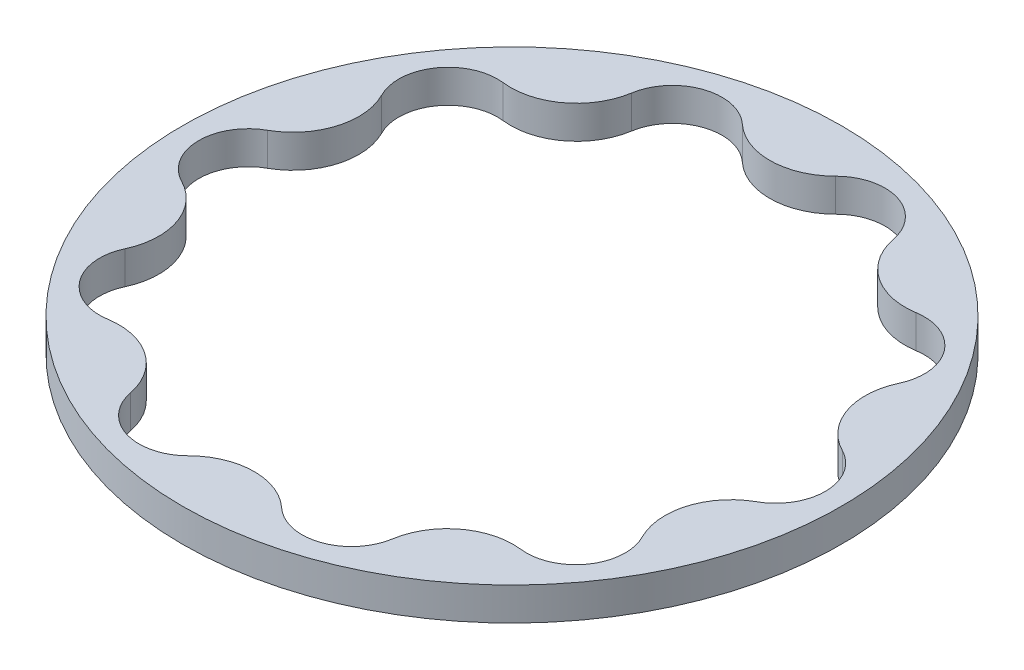
ISO-10303-21;
HEADER;
FILE_DESCRIPTION(('STEP AP214'),'2;1');
FILE_NAME('part.step','',(''),(''),'','','');
FILE_SCHEMA(('AUTOMOTIVE_DESIGN { 1 0 10303 214 1 1 1 1 }'));
ENDSEC;
DATA;
#1=APPLICATION_CONTEXT('core data for automotive mechanical design processes');
#2=APPLICATION_PROTOCOL_DEFINITION('international standard','automotive_design',2000,#1);
#3=PRODUCT_CONTEXT('',#1,'mechanical');
#4=PRODUCT('Part','Part','',(#3));
#5=PRODUCT_RELATED_PRODUCT_CATEGORY('part','',(#4));
#6=PRODUCT_DEFINITION_FORMATION('','',#4);
#7=PRODUCT_DEFINITION_CONTEXT('part definition',#1,'design');
#8=PRODUCT_DEFINITION('design','',#6,#7);
#9=PRODUCT_DEFINITION_SHAPE('','',#8);
#10=(LENGTH_UNIT() NAMED_UNIT(*) SI_UNIT(.MILLI.,.METRE.));
#11=(NAMED_UNIT(*) PLANE_ANGLE_UNIT() SI_UNIT($,.RADIAN.));
#12=(NAMED_UNIT(*) SI_UNIT($,.STERADIAN.) SOLID_ANGLE_UNIT());
#13=UNCERTAINTY_MEASURE_WITH_UNIT(LENGTH_MEASURE(1.E-05),#10,'distance_accuracy_value','');
#14=(GEOMETRIC_REPRESENTATION_CONTEXT(3) GLOBAL_UNCERTAINTY_ASSIGNED_CONTEXT((#13)) GLOBAL_UNIT_ASSIGNED_CONTEXT((#10,
#11,#12)) REPRESENTATION_CONTEXT('',''));
#15=CARTESIAN_POINT('',(0.,0.,0.));
#16=DIRECTION('',(0.,0.,1.));
#17=DIRECTION('',(1.,0.,0.));
#18=AXIS2_PLACEMENT_3D('',#15,#16,#17);
#19=CARTESIAN_POINT('',(-25.6423198178453,10.,-74.3524978353741));
#20=DIRECTION('',(0.,-1.,0.));
#21=DIRECTION('',(0.,0.,-1.));
#22=AXIS2_PLACEMENT_3D('',#19,#20,#21);
#23=CYLINDRICAL_SURFACE('',#22,15.);
#24=CARTESIAN_POINT('',(-25.6423198178453,0.,-74.3524978353741));
#25=DIRECTION('',(0.,1.,0.));
#26=DIRECTION('',(0.,0.,1.));
#27=AXIS2_PLACEMENT_3D('',#24,#25,#26);
#28=CIRCLE('',#27,15.);
#29=CARTESIAN_POINT('',(-40.455763135708,0.,-76.7108652936951));
#30=VERTEX_POINT('',#29);
#31=CARTESIAN_POINT('',(-15.4318718264707,0.,-85.3409805247828));
#32=VERTEX_POINT('',#31);
#33=EDGE_CURVE('E223',#30,#32,#28,.F.);
#34=ORIENTED_EDGE('',*,*,#33,.T.);
#35=DIRECTION('',(0.,-1.,0.));
#36=VECTOR('',#35,1.);
#37=CARTESIAN_POINT('',(-15.4318718264707,10.,-85.3409805247828));
#38=LINE('',#37,#36);
#39=CARTESIAN_POINT('',(-15.4318718264707,10.,-85.3409805247828));
#40=VERTEX_POINT('',#39);
#41=EDGE_CURVE('E11',#40,#32,#38,.T.);
#42=ORIENTED_EDGE('',*,*,#41,.F.);
#43=CARTESIAN_POINT('',(-25.6423198178453,10.,-74.3524978353741));
#44=DIRECTION('',(0.,1.,0.));
#45=DIRECTION('',(0.,0.,1.));
#46=AXIS2_PLACEMENT_3D('',#43,#44,#45);
#47=CIRCLE('',#46,15.);
#48=CARTESIAN_POINT('',(-40.455763135708,10.,-76.7108652936951));
#49=VERTEX_POINT('',#48);
#50=EDGE_CURVE('E420',#49,#40,#47,.F.);
#51=ORIENTED_EDGE('',*,*,#50,.F.);
#52=DIRECTION('',(0.,-1.,0.));
#53=VECTOR('',#52,1.);
#54=CARTESIAN_POINT('',(-40.455763135708,10.,-76.7108652936951));
#55=LINE('',#54,#53);
#56=EDGE_CURVE('E215',#49,#30,#55,.T.);
#57=ORIENTED_EDGE('',*,*,#56,.T.);
#58=EDGE_LOOP('',(#34,#42,#51,#57));
#59=FACE_BOUND('',#58,.T.);
#60=ADVANCED_FACE('F45',(#59),#23,.F.);
#61=CARTESIAN_POINT('',(-1.79476209093551,10.,-100.017236100354));
#62=DIRECTION('',(0.,-1.,0.));
#63=DIRECTION('',(0.,0.,-1.));
#64=AXIS2_PLACEMENT_3D('',#61,#62,#63);
#65=CYLINDRICAL_SURFACE('',#64,20.0340520029903);
#66=CARTESIAN_POINT('',(-1.79476209093551,0.,-100.017236100354));
#67=DIRECTION('',(0.,1.,0.));
#68=DIRECTION('',(0.,0.,1.));
#69=AXIS2_PLACEMENT_3D('',#66,#67,#68);
#70=CIRCLE('',#69,20.0340520029903);
#71=CARTESIAN_POINT('',(12.3601154130329,0.,-85.8396946172137));
#72=VERTEX_POINT('',#71);
#73=EDGE_CURVE('E227',#32,#72,#70,.T.);
#74=ORIENTED_EDGE('',*,*,#73,.T.);
#75=DIRECTION('',(0.,-1.,0.));
#76=VECTOR('',#75,1.);
#77=CARTESIAN_POINT('',(12.3601154130329,10.,-85.8396946172137));
#78=LINE('',#77,#76);
#79=CARTESIAN_POINT('',(12.3601154130329,10.,-85.8396946172137));
#80=VERTEX_POINT('',#79);
#81=EDGE_CURVE('E55',#80,#72,#78,.T.);
#82=ORIENTED_EDGE('',*,*,#81,.F.);
#83=CARTESIAN_POINT('',(-1.79476209093551,10.,-100.017236100354));
#84=DIRECTION('',(0.,1.,0.));
#85=DIRECTION('',(0.,0.,1.));
#86=AXIS2_PLACEMENT_3D('',#83,#84,#85);
#87=CIRCLE('',#86,20.0340520029903);
#88=EDGE_CURVE('E142',#40,#80,#87,.T.);
#89=ORIENTED_EDGE('',*,*,#88,.F.);
#90=ORIENTED_EDGE('',*,*,#41,.T.);
#91=EDGE_LOOP('',(#74,#82,#89,#90));
#92=FACE_BOUND('',#91,.T.);
#93=ADVANCED_FACE('F434',(#92),#65,.T.);
#94=CARTESIAN_POINT('',(22.9582291909062,10.,-75.2246117465409));
#95=DIRECTION('',(0.,-1.,0.));
#96=DIRECTION('',(0.,0.,-1.));
#97=AXIS2_PLACEMENT_3D('',#94,#95,#96);
#98=CYLINDRICAL_SURFACE('',#97,15.);
#99=CARTESIAN_POINT('',(22.9582291909062,0.,-75.2246117465409));
#100=DIRECTION('',(0.,1.,0.));
#101=DIRECTION('',(0.,0.,1.));
#102=AXIS2_PLACEMENT_3D('',#99,#100,#101);
#103=CIRCLE('',#102,15.);
#104=CARTESIAN_POINT('',(37.6775232060154,0.,-78.1129302360382));
#105=VERTEX_POINT('',#104);
#106=EDGE_CURVE('E230',#72,#105,#103,.F.);
#107=ORIENTED_EDGE('',*,*,#106,.T.);
#108=DIRECTION('',(0.,-1.,0.));
#109=VECTOR('',#108,1.);
#110=CARTESIAN_POINT('',(37.6775232060154,10.,-78.1129302360382));
#111=LINE('',#110,#109);
#112=CARTESIAN_POINT('',(37.6775232060154,10.,-78.1129302360382));
#113=VERTEX_POINT('',#112);
#114=EDGE_CURVE('E340',#113,#105,#111,.T.);
#115=ORIENTED_EDGE('',*,*,#114,.F.);
#116=CARTESIAN_POINT('',(22.9582291909062,10.,-75.2246117465409));
#117=DIRECTION('',(0.,1.,0.));
#118=DIRECTION('',(0.,0.,1.));
#119=AXIS2_PLACEMENT_3D('',#116,#117,#118);
#120=CIRCLE('',#119,15.);
#121=EDGE_CURVE('E350',#80,#113,#120,.F.);
#122=ORIENTED_EDGE('',*,*,#121,.F.);
#123=ORIENTED_EDGE('',*,*,#81,.T.);
#124=EDGE_LOOP('',(#107,#115,#122,#123));
#125=FACE_BOUND('',#124,.T.);
#126=ADVANCED_FACE('F348',(#125),#98,.F.);
#127=CARTESIAN_POINT('',(57.3366633224155,10.,-81.9705784240239));
#128=DIRECTION('',(0.,-1.,0.));
#129=DIRECTION('',(0.,0.,-1.));
#130=AXIS2_PLACEMENT_3D('',#127,#128,#129);
#131=CYLINDRICAL_SURFACE('',#130,20.0340520029903);
#132=CARTESIAN_POINT('',(57.3366633224155,0.,-81.9705784240239));
#133=DIRECTION('',(0.,1.,0.));
#134=DIRECTION('',(0.,0.,1.));
#135=AXIS2_PLACEMENT_3D('',#132,#133,#134);
#136=CIRCLE('',#135,20.0340520029903);
#137=CARTESIAN_POINT('',(60.4548499788668,0.,-62.1806781808683));
#138=VERTEX_POINT('',#137);
#139=EDGE_CURVE('E233',#105,#138,#136,.T.);
#140=ORIENTED_EDGE('',*,*,#139,.T.);
#141=DIRECTION('',(0.,-1.,0.));
#142=VECTOR('',#141,1.);
#143=CARTESIAN_POINT('',(60.4548499788668,10.,-62.1806781808683));
#144=LINE('',#143,#142);
#145=CARTESIAN_POINT('',(60.4548499788668,10.,-62.1806781808683));
#146=VERTEX_POINT('',#145);
#147=EDGE_CURVE('E336',#146,#138,#144,.T.);
#148=ORIENTED_EDGE('',*,*,#147,.F.);
#149=CARTESIAN_POINT('',(57.3366633224155,10.,-81.9705784240239));
#150=DIRECTION('',(0.,1.,0.));
#151=DIRECTION('',(0.,0.,1.));
#152=AXIS2_PLACEMENT_3D('',#149,#150,#151);
#153=CIRCLE('',#152,20.0340520029903);
#154=EDGE_CURVE('E369',#113,#146,#153,.T.);
#155=ORIENTED_EDGE('',*,*,#154,.F.);
#156=ORIENTED_EDGE('',*,*,#114,.T.);
#157=EDGE_LOOP('',(#140,#148,#155,#156));
#158=FACE_BOUND('',#157,.T.);
#159=ADVANCED_FACE('F359',(#158),#131,.T.);
#160=CARTESIAN_POINT('',(62.7895149702417,10.,-47.363480761044));
#161=DIRECTION('',(0.,-1.,0.));
#162=DIRECTION('',(0.,0.,-1.));
#163=AXIS2_PLACEMENT_3D('',#160,#161,#162);
#164=CYLINDRICAL_SURFACE('',#163,15.);
#165=CARTESIAN_POINT('',(62.7895149702417,0.,-47.363480761044));
#166=DIRECTION('',(0.,1.,0.));
#167=DIRECTION('',(0.,0.,1.));
#168=AXIS2_PLACEMENT_3D('',#165,#166,#167);
#169=CIRCLE('',#168,15.);
#170=CARTESIAN_POINT('',(76.3953849857166,0.,-41.0483955579766));
#171=VERTEX_POINT('',#170);
#172=EDGE_CURVE('E236',#138,#171,#169,.F.);
#173=ORIENTED_EDGE('',*,*,#172,.T.);
#174=DIRECTION('',(0.,-1.,0.));
#175=VECTOR('',#174,1.);
#176=CARTESIAN_POINT('',(76.3953849857166,10.,-41.0483955579766));
#177=LINE('',#176,#175);
#178=CARTESIAN_POINT('',(76.3953849857166,10.,-41.0483955579766));
#179=VERTEX_POINT('',#178);
#180=EDGE_CURVE('E332',#179,#171,#177,.T.);
#181=ORIENTED_EDGE('',*,*,#180,.F.);
#182=CARTESIAN_POINT('',(62.7895149702417,10.,-47.363480761044));
#183=DIRECTION('',(0.,1.,0.));
#184=DIRECTION('',(0.,0.,1.));
#185=AXIS2_PLACEMENT_3D('',#182,#183,#184);
#186=CIRCLE('',#185,15.);
#187=EDGE_CURVE('E365',#146,#179,#186,.F.);
#188=ORIENTED_EDGE('',*,*,#187,.F.);
#189=ORIENTED_EDGE('',*,*,#147,.T.);
#190=EDGE_LOOP('',(#173,#181,#188,#189));
#191=FACE_BOUND('',#190,.T.);
#192=ADVANCED_FACE('F363',(#191),#164,.F.);
#193=CARTESIAN_POINT('',(94.5674321481134,10.,-32.6139458672055));
#194=DIRECTION('',(0.,-1.,0.));
#195=DIRECTION('',(0.,0.,-1.));
#196=AXIS2_PLACEMENT_3D('',#193,#194,#195);
#197=CYLINDRICAL_SURFACE('',#196,20.0340520029903);
#198=CARTESIAN_POINT('',(94.5674321481134,0.,-32.6139458672055));
#199=DIRECTION('',(0.,1.,0.));
#200=DIRECTION('',(0.,0.,1.));
#201=AXIS2_PLACEMENT_3D('',#198,#199,#200);
#202=CIRCLE('',#201,20.0340520029903);
#203=CARTESIAN_POINT('',(85.4578866375495,0.,-14.7707561229505));
#204=VERTEX_POINT('',#203);
#205=EDGE_CURVE('E239',#171,#204,#202,.T.);
#206=ORIENTED_EDGE('',*,*,#205,.T.);
#207=DIRECTION('',(0.,-1.,0.));
#208=VECTOR('',#207,1.);
#209=CARTESIAN_POINT('',(85.4578866375495,10.,-14.7707561229505));
#210=LINE('',#209,#208);
#211=CARTESIAN_POINT('',(85.4578866375495,10.,-14.7707561229505));
#212=VERTEX_POINT('',#211);
#213=EDGE_CURVE('E328',#212,#204,#210,.T.);
#214=ORIENTED_EDGE('',*,*,#213,.F.);
#215=CARTESIAN_POINT('',(94.5674321481134,10.,-32.6139458672055));
#216=DIRECTION('',(0.,1.,0.));
#217=DIRECTION('',(0.,0.,1.));
#218=AXIS2_PLACEMENT_3D('',#215,#216,#217);
#219=CIRCLE('',#218,20.0340520029903);
#220=EDGE_CURVE('E368',#179,#212,#219,.T.);
#221=ORIENTED_EDGE('',*,*,#220,.F.);
#222=ORIENTED_EDGE('',*,*,#180,.T.);
#223=EDGE_LOOP('',(#206,#214,#221,#222));
#224=FACE_BOUND('',#223,.T.);
#225=ADVANCED_FACE('F446',(#224),#197,.T.);
#226=CARTESIAN_POINT('',(78.6373401680653,10.,-1.41110995033027));
#227=DIRECTION('',(0.,-1.,0.));
#228=DIRECTION('',(0.,0.,-1.));
#229=AXIS2_PLACEMENT_3D('',#226,#227,#228);
#230=CYLINDRICAL_SURFACE('',#229,15.);
#231=CARTESIAN_POINT('',(78.6373401680653,0.,-1.41110995033027));
#232=DIRECTION('',(0.,1.,0.));
#233=DIRECTION('',(0.,0.,1.));
#234=AXIS2_PLACEMENT_3D('',#231,#232,#233);
#235=CIRCLE('',#234,15.);
#236=CARTESIAN_POINT('',(85.9328062845076,0.,11.6952310395815));
#237=VERTEX_POINT('',#236);
#238=EDGE_CURVE('E242',#204,#237,#235,.F.);
#239=ORIENTED_EDGE('',*,*,#238,.T.);
#240=DIRECTION('',(0.,-1.,0.));
#241=VECTOR('',#240,1.);
#242=CARTESIAN_POINT('',(85.9328062845076,10.,11.6952310395815));
#243=LINE('',#242,#241);
#244=CARTESIAN_POINT('',(85.9328062845076,10.,11.6952310395815));
#245=VERTEX_POINT('',#244);
#246=EDGE_CURVE('E324',#245,#237,#243,.T.);
#247=ORIENTED_EDGE('',*,*,#246,.F.);
#248=CARTESIAN_POINT('',(78.6373401680653,10.,-1.41110995033027));
#249=DIRECTION('',(0.,1.,0.));
#250=DIRECTION('',(0.,0.,1.));
#251=AXIS2_PLACEMENT_3D('',#248,#249,#250);
#252=CIRCLE('',#251,15.);
#253=EDGE_CURVE('E373',#212,#245,#252,.F.);
#254=ORIENTED_EDGE('',*,*,#253,.F.);
#255=ORIENTED_EDGE('',*,*,#213,.T.);
#256=EDGE_LOOP('',(#239,#247,#254,#255));
#257=FACE_BOUND('',#256,.T.);
#258=ADVANCED_FACE('F449',(#257),#230,.F.);
#259=CARTESIAN_POINT('',(95.6766561220316,10.,29.200105503636));
#260=DIRECTION('',(0.,-1.,0.));
#261=DIRECTION('',(0.,0.,-1.));
#262=AXIS2_PLACEMENT_3D('',#259,#260,#261);
#263=CYLINDRICAL_SURFACE('',#262,20.0340520029904);
#264=CARTESIAN_POINT('',(95.6766561220316,0.,29.200105503636));
#265=DIRECTION('',(0.,1.,0.));
#266=DIRECTION('',(0.,0.,1.));
#267=AXIS2_PLACEMENT_3D('',#264,#265,#266);
#268=CIRCLE('',#267,20.0340520029904);
#269=CARTESIAN_POINT('',(77.818915207424,0.,38.2810927343985));
#270=VERTEX_POINT('',#269);
#271=EDGE_CURVE('E245',#237,#270,#268,.T.);
#272=ORIENTED_EDGE('',*,*,#271,.T.);
#273=DIRECTION('',(0.,-1.,0.));
#274=VECTOR('',#273,1.);
#275=CARTESIAN_POINT('',(77.818915207424,10.,38.2810927343985));
#276=LINE('',#275,#274);
#277=CARTESIAN_POINT('',(77.818915207424,10.,38.2810927343985));
#278=VERTEX_POINT('',#277);
#279=EDGE_CURVE('E320',#278,#270,#276,.T.);
#280=ORIENTED_EDGE('',*,*,#279,.F.);
#281=CARTESIAN_POINT('',(95.6766561220316,10.,29.200105503636));
#282=DIRECTION('',(0.,1.,0.));
#283=DIRECTION('',(0.,0.,1.));
#284=AXIS2_PLACEMENT_3D('',#281,#282,#283);
#285=CIRCLE('',#284,20.0340520029904);
#286=EDGE_CURVE('E380',#245,#278,#285,.T.);
#287=ORIENTED_EDGE('',*,*,#286,.F.);
#288=ORIENTED_EDGE('',*,*,#246,.T.);
#289=EDGE_LOOP('',(#272,#280,#287,#288));
#290=FACE_BOUND('',#289,.T.);
#291=ADVANCED_FACE('F453',(#290),#263,.T.);
#292=CARTESIAN_POINT('',(64.4483742065755,10.,45.0802568995462));
#293=DIRECTION('',(0.,-1.,0.));
#294=DIRECTION('',(0.,0.,-1.));
#295=AXIS2_PLACEMENT_3D('',#292,#293,#294);
#296=CYLINDRICAL_SURFACE('',#295,15.);
#297=CARTESIAN_POINT('',(64.4483742065755,0.,45.0802568995462));
#298=DIRECTION('',(0.,1.,0.));
#299=DIRECTION('',(0.,0.,1.));
#300=AXIS2_PLACEMENT_3D('',#297,#298,#299);
#301=CIRCLE('',#300,15.);
#302=CARTESIAN_POINT('',(62.6468163312774,0.,59.971676886302));
#303=VERTEX_POINT('',#302);
#304=EDGE_CURVE('E248',#270,#303,#301,.F.);
#305=ORIENTED_EDGE('',*,*,#304,.T.);
#306=DIRECTION('',(0.,-1.,0.));
#307=VECTOR('',#306,1.);
#308=CARTESIAN_POINT('',(62.6468163312774,10.,59.971676886302));
#309=LINE('',#308,#307);
#310=CARTESIAN_POINT('',(62.6468163312774,10.,59.971676886302));
#311=VERTEX_POINT('',#310);
#312=EDGE_CURVE('E316',#311,#303,#309,.T.);
#313=ORIENTED_EDGE('',*,*,#312,.F.);
#314=CARTESIAN_POINT('',(64.4483742065755,10.,45.0802568995462));
#315=DIRECTION('',(0.,1.,0.));
#316=DIRECTION('',(0.,0.,1.));
#317=AXIS2_PLACEMENT_3D('',#314,#315,#316);
#318=CIRCLE('',#317,15.);
#319=EDGE_CURVE('E383',#278,#311,#318,.F.);
#320=ORIENTED_EDGE('',*,*,#319,.F.);
#321=ORIENTED_EDGE('',*,*,#279,.T.);
#322=EDGE_LOOP('',(#305,#313,#320,#321));
#323=FACE_BOUND('',#322,.T.);
#324=ADVANCED_FACE('F457',(#323),#296,.F.);
#325=CARTESIAN_POINT('',(60.2406493872696,10.,79.8607090471711));
#326=DIRECTION('',(0.,-1.,0.));
#327=DIRECTION('',(0.,0.,-1.));
#328=AXIS2_PLACEMENT_3D('',#325,#326,#327);
#329=CYLINDRICAL_SURFACE('',#328,20.0340520029904);
#330=CARTESIAN_POINT('',(60.2406493872696,0.,79.8607090471711));
#331=DIRECTION('',(0.,1.,0.));
#332=DIRECTION('',(0.,0.,1.));
#333=AXIS2_PLACEMENT_3D('',#330,#331,#332);
#334=CIRCLE('',#333,20.0340520029904);
#335=CARTESIAN_POINT('',(40.4557631357087,0.,76.7108652936937));
#336=VERTEX_POINT('',#335);
#337=EDGE_CURVE('E251',#303,#336,#334,.T.);
#338=ORIENTED_EDGE('',*,*,#337,.T.);
#339=DIRECTION('',(0.,-1.,0.));
#340=VECTOR('',#339,1.);
#341=CARTESIAN_POINT('',(40.4557631357087,10.,76.7108652936937));
#342=LINE('',#341,#340);
#343=CARTESIAN_POINT('',(40.4557631357087,10.,76.7108652936937));
#344=VERTEX_POINT('',#343);
#345=EDGE_CURVE('E312',#344,#336,#342,.T.);
#346=ORIENTED_EDGE('',*,*,#345,.F.);
#347=CARTESIAN_POINT('',(60.2406493872696,10.,79.8607090471711));
#348=DIRECTION('',(0.,1.,0.));
#349=DIRECTION('',(0.,0.,1.));
#350=AXIS2_PLACEMENT_3D('',#347,#348,#349);
#351=CIRCLE('',#350,20.0340520029904);
#352=EDGE_CURVE('E386',#311,#344,#351,.T.);
#353=ORIENTED_EDGE('',*,*,#352,.F.);
#354=ORIENTED_EDGE('',*,*,#312,.T.);
#355=EDGE_LOOP('',(#338,#346,#353,#354));
#356=FACE_BOUND('',#355,.T.);
#357=ADVANCED_FACE('F461',(#356),#329,.T.);
#358=CARTESIAN_POINT('',(25.642319817846,10.,74.3524978353726));
#359=DIRECTION('',(0.,-1.,0.));
#360=DIRECTION('',(0.,0.,-1.));
#361=AXIS2_PLACEMENT_3D('',#358,#359,#360);
#362=CYLINDRICAL_SURFACE('',#361,15.);
#363=CARTESIAN_POINT('',(25.642319817846,0.,74.3524978353726));
#364=DIRECTION('',(0.,1.,0.));
#365=DIRECTION('',(0.,0.,1.));
#366=AXIS2_PLACEMENT_3D('',#363,#364,#365);
#367=CIRCLE('',#366,15.);
#368=CARTESIAN_POINT('',(15.4318718264714,0.,85.3409805247814));
#369=VERTEX_POINT('',#368);
#370=EDGE_CURVE('E254',#336,#369,#367,.F.);
#371=ORIENTED_EDGE('',*,*,#370,.T.);
#372=DIRECTION('',(0.,-1.,0.));
#373=VECTOR('',#372,1.);
#374=CARTESIAN_POINT('',(15.4318718264714,10.,85.3409805247814));
#375=LINE('',#374,#373);
#376=CARTESIAN_POINT('',(15.4318718264714,10.,85.3409805247814));
#377=VERTEX_POINT('',#376);
#378=EDGE_CURVE('E308',#377,#369,#375,.T.);
#379=ORIENTED_EDGE('',*,*,#378,.F.);
#380=CARTESIAN_POINT('',(25.642319817846,10.,74.3524978353726));
#381=DIRECTION('',(0.,1.,0.));
#382=DIRECTION('',(0.,0.,1.));
#383=AXIS2_PLACEMENT_3D('',#380,#381,#382);
#384=CIRCLE('',#383,15.);
#385=EDGE_CURVE('E389',#344,#377,#384,.F.);
#386=ORIENTED_EDGE('',*,*,#385,.F.);
#387=ORIENTED_EDGE('',*,*,#345,.T.);
#388=EDGE_LOOP('',(#371,#379,#386,#387));
#389=FACE_BOUND('',#388,.T.);
#390=ADVANCED_FACE('F465',(#389),#362,.F.);
#391=CARTESIAN_POINT('',(1.79476209093625,10.,100.017236100353));
#392=DIRECTION('',(0.,-1.,0.));
#393=DIRECTION('',(0.,0.,-1.));
#394=AXIS2_PLACEMENT_3D('',#391,#392,#393);
#395=CYLINDRICAL_SURFACE('',#394,20.0340520029904);
#396=CARTESIAN_POINT('',(1.79476209093625,0.,100.017236100353));
#397=DIRECTION('',(0.,1.,0.));
#398=DIRECTION('',(0.,0.,1.));
#399=AXIS2_PLACEMENT_3D('',#396,#397,#398);
#400=CIRCLE('',#399,20.0340520029904);
#401=CARTESIAN_POINT('',(-12.3601154130321,0.,85.8396946172123));
#402=VERTEX_POINT('',#401);
#403=EDGE_CURVE('E257',#369,#402,#400,.T.);
#404=ORIENTED_EDGE('',*,*,#403,.T.);
#405=DIRECTION('',(0.,-1.,0.));
#406=VECTOR('',#405,1.);
#407=CARTESIAN_POINT('',(-12.3601154130321,10.,85.8396946172123));
#408=LINE('',#407,#406);
#409=CARTESIAN_POINT('',(-12.3601154130321,10.,85.8396946172123));
#410=VERTEX_POINT('',#409);
#411=EDGE_CURVE('E304',#410,#402,#408,.T.);
#412=ORIENTED_EDGE('',*,*,#411,.F.);
#413=CARTESIAN_POINT('',(1.79476209093625,10.,100.017236100353));
#414=DIRECTION('',(0.,1.,0.));
#415=DIRECTION('',(0.,0.,1.));
#416=AXIS2_PLACEMENT_3D('',#413,#414,#415);
#417=CIRCLE('',#416,20.0340520029904);
#418=EDGE_CURVE('E392',#377,#410,#417,.T.);
#419=ORIENTED_EDGE('',*,*,#418,.F.);
#420=ORIENTED_EDGE('',*,*,#378,.T.);
#421=EDGE_LOOP('',(#404,#412,#419,#420));
#422=FACE_BOUND('',#421,.T.);
#423=ADVANCED_FACE('F469',(#422),#395,.T.);
#424=CARTESIAN_POINT('',(-22.9582291909055,10.,75.2246117465395));
#425=DIRECTION('',(0.,-1.,0.));
#426=DIRECTION('',(0.,0.,-1.));
#427=AXIS2_PLACEMENT_3D('',#424,#425,#426);
#428=CYLINDRICAL_SURFACE('',#427,15.);
#429=CARTESIAN_POINT('',(-22.9582291909055,0.,75.2246117465395));
#430=DIRECTION('',(0.,1.,0.));
#431=DIRECTION('',(0.,0.,1.));
#432=AXIS2_PLACEMENT_3D('',#429,#430,#431);
#433=CIRCLE('',#432,15.);
#434=CARTESIAN_POINT('',(-37.6775232060147,0.,78.1129302360368));
#435=VERTEX_POINT('',#434);
#436=EDGE_CURVE('E260',#402,#435,#433,.F.);
#437=ORIENTED_EDGE('',*,*,#436,.T.);
#438=DIRECTION('',(0.,-1.,0.));
#439=VECTOR('',#438,1.);
#440=CARTESIAN_POINT('',(-37.6775232060147,10.,78.1129302360368));
#441=LINE('',#440,#439);
#442=CARTESIAN_POINT('',(-37.6775232060147,10.,78.1129302360368));
#443=VERTEX_POINT('',#442);
#444=EDGE_CURVE('E300',#443,#435,#441,.T.);
#445=ORIENTED_EDGE('',*,*,#444,.F.);
#446=CARTESIAN_POINT('',(-22.9582291909055,10.,75.2246117465395));
#447=DIRECTION('',(0.,1.,0.));
#448=DIRECTION('',(0.,0.,1.));
#449=AXIS2_PLACEMENT_3D('',#446,#447,#448);
#450=CIRCLE('',#449,15.);
#451=EDGE_CURVE('E395',#410,#443,#450,.F.);
#452=ORIENTED_EDGE('',*,*,#451,.F.);
#453=ORIENTED_EDGE('',*,*,#411,.T.);
#454=EDGE_LOOP('',(#437,#445,#452,#453));
#455=FACE_BOUND('',#454,.T.);
#456=ADVANCED_FACE('F473',(#455),#428,.F.);
#457=CARTESIAN_POINT('',(-57.3366633224148,10.,81.9705784240225));
#458=DIRECTION('',(0.,-1.,0.));
#459=DIRECTION('',(0.,0.,-1.));
#460=AXIS2_PLACEMENT_3D('',#457,#458,#459);
#461=CYLINDRICAL_SURFACE('',#460,20.0340520029904);
#462=CARTESIAN_POINT('',(-57.3366633224148,0.,81.9705784240225));
#463=DIRECTION('',(0.,1.,0.));
#464=DIRECTION('',(0.,0.,1.));
#465=AXIS2_PLACEMENT_3D('',#462,#463,#464);
#466=CIRCLE('',#465,20.0340520029904);
#467=CARTESIAN_POINT('',(-60.4548499788661,0.,62.1806781808669));
#468=VERTEX_POINT('',#467);
#469=EDGE_CURVE('E263',#435,#468,#466,.T.);
#470=ORIENTED_EDGE('',*,*,#469,.T.);
#471=DIRECTION('',(0.,-1.,0.));
#472=VECTOR('',#471,1.);
#473=CARTESIAN_POINT('',(-60.4548499788661,10.,62.1806781808669));
#474=LINE('',#473,#472);
#475=CARTESIAN_POINT('',(-60.4548499788661,10.,62.1806781808669));
#476=VERTEX_POINT('',#475);
#477=EDGE_CURVE('E296',#476,#468,#474,.T.);
#478=ORIENTED_EDGE('',*,*,#477,.F.);
#479=CARTESIAN_POINT('',(-57.3366633224148,10.,81.9705784240225));
#480=DIRECTION('',(0.,1.,0.));
#481=DIRECTION('',(0.,0.,1.));
#482=AXIS2_PLACEMENT_3D('',#479,#480,#481);
#483=CIRCLE('',#482,20.0340520029904);
#484=EDGE_CURVE('E398',#443,#476,#483,.T.);
#485=ORIENTED_EDGE('',*,*,#484,.F.);
#486=ORIENTED_EDGE('',*,*,#444,.T.);
#487=EDGE_LOOP('',(#470,#478,#485,#486));
#488=FACE_BOUND('',#487,.T.);
#489=ADVANCED_FACE('F477',(#488),#461,.T.);
#490=CARTESIAN_POINT('',(-62.789514970241,10.,47.3634807610426));
#491=DIRECTION('',(0.,-1.,0.));
#492=DIRECTION('',(0.,0.,-1.));
#493=AXIS2_PLACEMENT_3D('',#490,#491,#492);
#494=CYLINDRICAL_SURFACE('',#493,15.);
#495=CARTESIAN_POINT('',(-62.789514970241,0.,47.3634807610426));
#496=DIRECTION('',(0.,1.,0.));
#497=DIRECTION('',(0.,0.,1.));
#498=AXIS2_PLACEMENT_3D('',#495,#496,#497);
#499=CIRCLE('',#498,15.);
#500=CARTESIAN_POINT('',(-76.3953849857159,0.,41.0483955579752));
#501=VERTEX_POINT('',#500);
#502=EDGE_CURVE('E266',#468,#501,#499,.F.);
#503=ORIENTED_EDGE('',*,*,#502,.T.);
#504=DIRECTION('',(0.,-1.,0.));
#505=VECTOR('',#504,1.);
#506=CARTESIAN_POINT('',(-76.3953849857159,10.,41.0483955579752));
#507=LINE('',#506,#505);
#508=CARTESIAN_POINT('',(-76.3953849857159,10.,41.0483955579752));
#509=VERTEX_POINT('',#508);
#510=EDGE_CURVE('E292',#509,#501,#507,.T.);
#511=ORIENTED_EDGE('',*,*,#510,.F.);
#512=CARTESIAN_POINT('',(-62.789514970241,10.,47.3634807610426));
#513=DIRECTION('',(0.,1.,0.));
#514=DIRECTION('',(0.,0.,1.));
#515=AXIS2_PLACEMENT_3D('',#512,#513,#514);
#516=CIRCLE('',#515,15.);
#517=EDGE_CURVE('E401',#476,#509,#516,.F.);
#518=ORIENTED_EDGE('',*,*,#517,.F.);
#519=ORIENTED_EDGE('',*,*,#477,.T.);
#520=EDGE_LOOP('',(#503,#511,#518,#519));
#521=FACE_BOUND('',#520,.T.);
#522=ADVANCED_FACE('F481',(#521),#494,.F.);
#523=CARTESIAN_POINT('',(-94.5674321481127,10.,32.6139458672041));
#524=DIRECTION('',(0.,-1.,0.));
#525=DIRECTION('',(0.,0.,-1.));
#526=AXIS2_PLACEMENT_3D('',#523,#524,#525);
#527=CYLINDRICAL_SURFACE('',#526,20.0340520029904);
#528=CARTESIAN_POINT('',(-94.5674321481127,0.,32.6139458672041));
#529=DIRECTION('',(0.,1.,0.));
#530=DIRECTION('',(0.,0.,1.));
#531=AXIS2_PLACEMENT_3D('',#528,#529,#530);
#532=CIRCLE('',#531,20.0340520029904);
#533=CARTESIAN_POINT('',(-85.4578866375488,0.,14.7707561229491));
#534=VERTEX_POINT('',#533);
#535=EDGE_CURVE('E269',#501,#534,#532,.T.);
#536=ORIENTED_EDGE('',*,*,#535,.T.);
#537=DIRECTION('',(0.,-1.,0.));
#538=VECTOR('',#537,1.);
#539=CARTESIAN_POINT('',(-85.4578866375488,10.,14.7707561229491));
#540=LINE('',#539,#538);
#541=CARTESIAN_POINT('',(-85.4578866375488,10.,14.7707561229491));
#542=VERTEX_POINT('',#541);
#543=EDGE_CURVE('E288',#542,#534,#540,.T.);
#544=ORIENTED_EDGE('',*,*,#543,.F.);
#545=CARTESIAN_POINT('',(-94.5674321481127,10.,32.6139458672041));
#546=DIRECTION('',(0.,1.,0.));
#547=DIRECTION('',(0.,0.,1.));
#548=AXIS2_PLACEMENT_3D('',#545,#546,#547);
#549=CIRCLE('',#548,20.0340520029904);
#550=EDGE_CURVE('E404',#509,#542,#549,.T.);
#551=ORIENTED_EDGE('',*,*,#550,.F.);
#552=ORIENTED_EDGE('',*,*,#510,.T.);
#553=EDGE_LOOP('',(#536,#544,#551,#552));
#554=FACE_BOUND('',#553,.T.);
#555=ADVANCED_FACE('F412',(#554),#527,.T.);
#556=CARTESIAN_POINT('',(-78.6373401680646,10.,1.41110995032888));
#557=DIRECTION('',(0.,-1.,0.));
#558=DIRECTION('',(0.,0.,-1.));
#559=AXIS2_PLACEMENT_3D('',#556,#557,#558);
#560=CYLINDRICAL_SURFACE('',#559,15.);
#561=CARTESIAN_POINT('',(-78.6373401680646,0.,1.41110995032888));
#562=DIRECTION('',(0.,1.,0.));
#563=DIRECTION('',(0.,0.,1.));
#564=AXIS2_PLACEMENT_3D('',#561,#562,#563);
#565=CIRCLE('',#564,15.);
#566=CARTESIAN_POINT('',(-85.9328062845069,0.,-11.6952310395829));
#567=VERTEX_POINT('',#566);
#568=EDGE_CURVE('E272',#534,#567,#565,.F.);
#569=ORIENTED_EDGE('',*,*,#568,.T.);
#570=DIRECTION('',(0.,-1.,0.));
#571=VECTOR('',#570,1.);
#572=CARTESIAN_POINT('',(-85.9328062845069,10.,-11.6952310395829));
#573=LINE('',#572,#571);
#574=CARTESIAN_POINT('',(-85.9328062845069,10.,-11.6952310395829));
#575=VERTEX_POINT('',#574);
#576=EDGE_CURVE('E208',#575,#567,#573,.T.);
#577=ORIENTED_EDGE('',*,*,#576,.F.);
#578=CARTESIAN_POINT('',(-78.6373401680646,10.,1.41110995032888));
#579=DIRECTION('',(0.,1.,0.));
#580=DIRECTION('',(0.,0.,1.));
#581=AXIS2_PLACEMENT_3D('',#578,#579,#580);
#582=CIRCLE('',#581,15.);
#583=EDGE_CURVE('E197',#542,#575,#582,.F.);
#584=ORIENTED_EDGE('',*,*,#583,.F.);
#585=ORIENTED_EDGE('',*,*,#543,.T.);
#586=EDGE_LOOP('',(#569,#577,#584,#585));
#587=FACE_BOUND('',#586,.T.);
#588=ADVANCED_FACE('F416',(#587),#560,.F.);
#589=CARTESIAN_POINT('',(-95.6766561220309,10.,-29.2001055036374));
#590=DIRECTION('',(0.,-1.,0.));
#591=DIRECTION('',(0.,0.,-1.));
#592=AXIS2_PLACEMENT_3D('',#589,#590,#591);
#593=CYLINDRICAL_SURFACE('',#592,20.0340520029903);
#594=CARTESIAN_POINT('',(-95.6766561220309,0.,-29.2001055036374));
#595=DIRECTION('',(0.,1.,0.));
#596=DIRECTION('',(0.,0.,1.));
#597=AXIS2_PLACEMENT_3D('',#594,#595,#596);
#598=CIRCLE('',#597,20.0340520029903);
#599=CARTESIAN_POINT('',(-77.8189152074233,0.,-38.2810927343999));
#600=VERTEX_POINT('',#599);
#601=EDGE_CURVE('E206',#567,#600,#598,.T.);
#602=ORIENTED_EDGE('',*,*,#601,.T.);
#603=DIRECTION('',(0.,-1.,0.));
#604=VECTOR('',#603,1.);
#605=CARTESIAN_POINT('',(-77.8189152074233,10.,-38.2810927343999));
#606=LINE('',#605,#604);
#607=CARTESIAN_POINT('',(-77.8189152074233,10.,-38.2810927343999));
#608=VERTEX_POINT('',#607);
#609=EDGE_CURVE('E203',#608,#600,#606,.T.);
#610=ORIENTED_EDGE('',*,*,#609,.F.);
#611=CARTESIAN_POINT('',(-95.6766561220309,10.,-29.2001055036374));
#612=DIRECTION('',(0.,1.,0.));
#613=DIRECTION('',(0.,0.,1.));
#614=AXIS2_PLACEMENT_3D('',#611,#612,#613);
#615=CIRCLE('',#614,20.0340520029903);
#616=EDGE_CURVE('E191',#575,#608,#615,.T.);
#617=ORIENTED_EDGE('',*,*,#616,.F.);
#618=ORIENTED_EDGE('',*,*,#576,.T.);
#619=EDGE_LOOP('',(#602,#610,#617,#618));
#620=FACE_BOUND('',#619,.T.);
#621=ADVANCED_FACE('F204',(#620),#593,.T.);
#622=CARTESIAN_POINT('',(-64.4483742065747,10.,-45.0802568995476));
#623=DIRECTION('',(0.,-1.,0.));
#624=DIRECTION('',(0.,0.,-1.));
#625=AXIS2_PLACEMENT_3D('',#622,#623,#624);
#626=CYLINDRICAL_SURFACE('',#625,15.);
#627=CARTESIAN_POINT('',(-64.4483742065747,0.,-45.0802568995476));
#628=DIRECTION('',(0.,1.,0.));
#629=DIRECTION('',(0.,0.,1.));
#630=AXIS2_PLACEMENT_3D('',#627,#628,#629);
#631=CIRCLE('',#630,15.);
#632=CARTESIAN_POINT('',(-62.6468163312767,0.,-59.9716768863034));
#633=VERTEX_POINT('',#632);
#634=EDGE_CURVE('E128',#600,#633,#631,.F.);
#635=ORIENTED_EDGE('',*,*,#634,.T.);
#636=DIRECTION('',(0.,-1.,0.));
#637=VECTOR('',#636,1.);
#638=CARTESIAN_POINT('',(-62.6468163312767,10.,-59.9716768863034));
#639=LINE('',#638,#637);
#640=CARTESIAN_POINT('',(-62.6468163312767,10.,-59.9716768863034));
#641=VERTEX_POINT('',#640);
#642=EDGE_CURVE('E209',#641,#633,#639,.T.);
#643=ORIENTED_EDGE('',*,*,#642,.F.);
#644=CARTESIAN_POINT('',(-64.4483742065747,10.,-45.0802568995476));
#645=DIRECTION('',(0.,1.,0.));
#646=DIRECTION('',(0.,0.,1.));
#647=AXIS2_PLACEMENT_3D('',#644,#645,#646);
#648=CIRCLE('',#647,15.);
#649=EDGE_CURVE('E195',#608,#641,#648,.F.);
#650=ORIENTED_EDGE('',*,*,#649,.F.);
#651=ORIENTED_EDGE('',*,*,#609,.T.);
#652=EDGE_LOOP('',(#635,#643,#650,#651));
#653=FACE_BOUND('',#652,.T.);
#654=ADVANCED_FACE('F211',(#653),#626,.F.);
#655=CARTESIAN_POINT('',(0.,10.,0.));
#656=DIRECTION('',(0.,-1.,0.));
#657=DIRECTION('',(0.,0.,-1.));
#658=AXIS2_PLACEMENT_3D('',#655,#656,#657);
#659=CYLINDRICAL_SURFACE('',#658,100.);
#660=CARTESIAN_POINT('',(0.,10.,0.));
#661=DIRECTION('',(0.,1.,0.));
#662=DIRECTION('',(0.,0.,1.));
#663=AXIS2_PLACEMENT_3D('',#660,#661,#662);
#664=CIRCLE('',#663,100.);
#665=CARTESIAN_POINT('',(0.,10.,100.));
#666=VERTEX_POINT('',#665);
#667=EDGE_CURVE('E281',#666,#666,#664,.T.);
#668=ORIENTED_EDGE('',*,*,#667,.F.);
#669=EDGE_LOOP('',(#668));
#670=FACE_BOUND('',#669,.T.);
#671=CARTESIAN_POINT('',(0.,0.,0.));
#672=DIRECTION('',(0.,1.,0.));
#673=DIRECTION('',(0.,0.,1.));
#674=AXIS2_PLACEMENT_3D('',#671,#672,#673);
#675=CIRCLE('',#674,100.);
#676=CARTESIAN_POINT('',(0.,0.,100.));
#677=VERTEX_POINT('',#676);
#678=EDGE_CURVE('E219',#677,#677,#675,.T.);
#679=ORIENTED_EDGE('',*,*,#678,.T.);
#680=EDGE_LOOP('',(#679));
#681=FACE_BOUND('',#680,.T.);
#682=ADVANCED_FACE('F47',(#670,#681),#659,.T.);
#683=CARTESIAN_POINT('',(-60.2406493872689,10.,-79.8607090471725));
#684=DIRECTION('',(0.,-1.,0.));
#685=DIRECTION('',(0.,0.,-1.));
#686=AXIS2_PLACEMENT_3D('',#683,#684,#685);
#687=CYLINDRICAL_SURFACE('',#686,20.0340520029904);
#688=CARTESIAN_POINT('',(-60.2406493872689,0.,-79.8607090471725));
#689=DIRECTION('',(0.,1.,0.));
#690=DIRECTION('',(0.,0.,1.));
#691=AXIS2_PLACEMENT_3D('',#688,#689,#690);
#692=CIRCLE('',#691,20.0340520029904);
#693=EDGE_CURVE('E134',#633,#30,#692,.T.);
#694=ORIENTED_EDGE('',*,*,#693,.T.);
#695=ORIENTED_EDGE('',*,*,#56,.F.);
#696=CARTESIAN_POINT('',(-60.2406493872689,10.,-79.8607090471725));
#697=DIRECTION('',(0.,1.,0.));
#698=DIRECTION('',(0.,0.,1.));
#699=AXIS2_PLACEMENT_3D('',#696,#697,#698);
#700=CIRCLE('',#699,20.0340520029904);
#701=EDGE_CURVE('E63',#641,#49,#700,.T.);
#702=ORIENTED_EDGE('',*,*,#701,.F.);
#703=ORIENTED_EDGE('',*,*,#642,.T.);
#704=EDGE_LOOP('',(#694,#695,#702,#703));
#705=FACE_BOUND('',#704,.T.);
#706=ADVANCED_FACE('F421',(#705),#687,.T.);
#707=CARTESIAN_POINT('',(0.,10.,0.));
#708=DIRECTION('',(0.,1.,0.));
#709=DIRECTION('',(0.,0.,1.));
#710=AXIS2_PLACEMENT_3D('',#707,#708,#709);
#711=PLANE('',#710);
#712=ORIENTED_EDGE('',*,*,#667,.T.);
#713=EDGE_LOOP('',(#712));
#714=FACE_BOUND('',#713,.T.);
#715=ORIENTED_EDGE('',*,*,#50,.T.);
#716=ORIENTED_EDGE('',*,*,#88,.T.);
#717=ORIENTED_EDGE('',*,*,#121,.T.);
#718=ORIENTED_EDGE('',*,*,#154,.T.);
#719=ORIENTED_EDGE('',*,*,#187,.T.);
#720=ORIENTED_EDGE('',*,*,#220,.T.);
#721=ORIENTED_EDGE('',*,*,#253,.T.);
#722=ORIENTED_EDGE('',*,*,#286,.T.);
#723=ORIENTED_EDGE('',*,*,#319,.T.);
#724=ORIENTED_EDGE('',*,*,#352,.T.);
#725=ORIENTED_EDGE('',*,*,#385,.T.);
#726=ORIENTED_EDGE('',*,*,#418,.T.);
#727=ORIENTED_EDGE('',*,*,#451,.T.);
#728=ORIENTED_EDGE('',*,*,#484,.T.);
#729=ORIENTED_EDGE('',*,*,#517,.T.);
#730=ORIENTED_EDGE('',*,*,#550,.T.);
#731=ORIENTED_EDGE('',*,*,#583,.T.);
#732=ORIENTED_EDGE('',*,*,#616,.T.);
#733=ORIENTED_EDGE('',*,*,#649,.T.);
#734=ORIENTED_EDGE('',*,*,#701,.T.);
#735=EDGE_LOOP('',(#715,#716,#717,#718,#719,#720,#721,#722,#723,#724,#725,#726,#727,#728,#729,
#730,#731,#732,#733,#734));
#736=FACE_BOUND('',#735,.T.);
#737=ADVANCED_FACE('F193',(#714,#736),#711,.T.);
#738=CARTESIAN_POINT('',(0.,0.,0.));
#739=DIRECTION('',(0.,1.,0.));
#740=DIRECTION('',(0.,0.,1.));
#741=AXIS2_PLACEMENT_3D('',#738,#739,#740);
#742=PLANE('',#741);
#743=ORIENTED_EDGE('',*,*,#678,.F.);
#744=EDGE_LOOP('',(#743));
#745=FACE_BOUND('',#744,.T.);
#746=ORIENTED_EDGE('',*,*,#33,.F.);
#747=ORIENTED_EDGE('',*,*,#693,.F.);
#748=ORIENTED_EDGE('',*,*,#634,.F.);
#749=ORIENTED_EDGE('',*,*,#601,.F.);
#750=ORIENTED_EDGE('',*,*,#568,.F.);
#751=ORIENTED_EDGE('',*,*,#535,.F.);
#752=ORIENTED_EDGE('',*,*,#502,.F.);
#753=ORIENTED_EDGE('',*,*,#469,.F.);
#754=ORIENTED_EDGE('',*,*,#436,.F.);
#755=ORIENTED_EDGE('',*,*,#403,.F.);
#756=ORIENTED_EDGE('',*,*,#370,.F.);
#757=ORIENTED_EDGE('',*,*,#337,.F.);
#758=ORIENTED_EDGE('',*,*,#304,.F.);
#759=ORIENTED_EDGE('',*,*,#271,.F.);
#760=ORIENTED_EDGE('',*,*,#238,.F.);
#761=ORIENTED_EDGE('',*,*,#205,.F.);
#762=ORIENTED_EDGE('',*,*,#172,.F.);
#763=ORIENTED_EDGE('',*,*,#139,.F.);
#764=ORIENTED_EDGE('',*,*,#106,.F.);
#765=ORIENTED_EDGE('',*,*,#73,.F.);
#766=EDGE_LOOP('',(#746,#747,#748,#749,#750,#751,#752,#753,#754,#755,#756,#757,#758,#759,#760,
#761,#762,#763,#764,#765));
#767=FACE_BOUND('',#766,.T.);
#768=ADVANCED_FACE('F354',(#745,#767),#742,.F.);
#769=CLOSED_SHELL('',(#60,#93,#126,#159,#192,#225,#258,#291,#324,#357,#390,#423,#456,#489,#522,
#555,#588,#621,#654,#682,#706,#737,#768));
#770=MANIFOLD_SOLID_BREP('B2',#769);
#771=ADVANCED_BREP_SHAPE_REPRESENTATION('',(#18,#770),#14);
#772=SHAPE_DEFINITION_REPRESENTATION(#9,#771);
ENDSEC;
END-ISO-10303-21;
